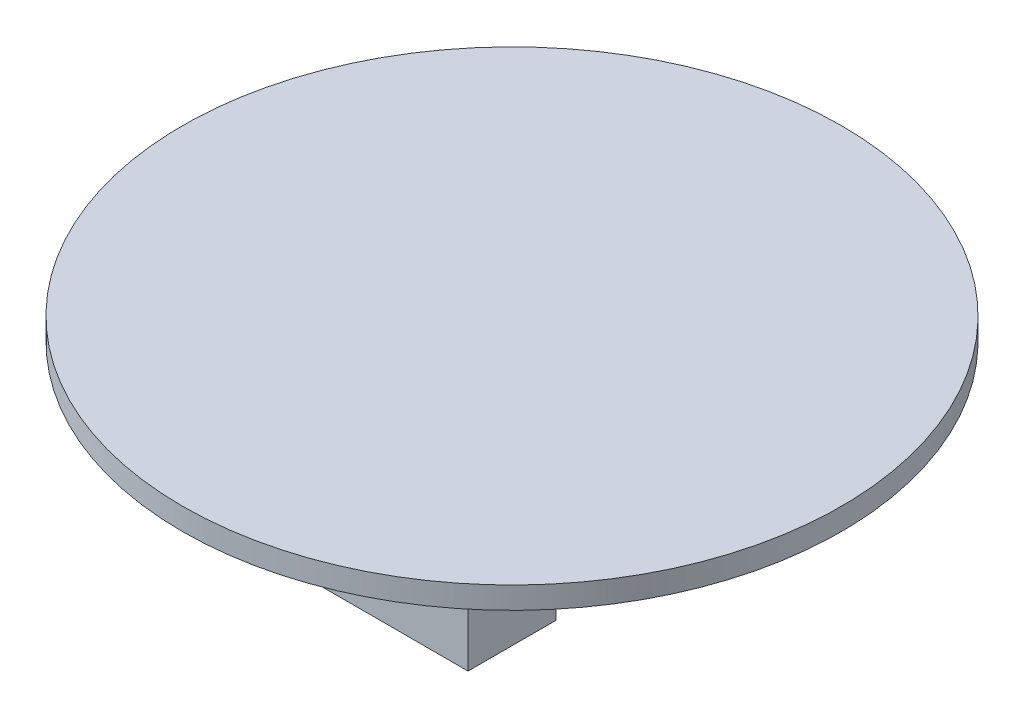
ISO-10303-21;
HEADER;
FILE_DESCRIPTION(('STEP AP214'),'2;1');
FILE_NAME('part.step','',(''),(''),'','','');
FILE_SCHEMA(('AUTOMOTIVE_DESIGN { 1 0 10303 214 1 1 1 1 }'));
ENDSEC;
DATA;
#1=APPLICATION_CONTEXT('core data for automotive mechanical design processes');
#2=APPLICATION_PROTOCOL_DEFINITION('international standard','automotive_design',2000,#1);
#3=PRODUCT_CONTEXT('',#1,'mechanical');
#4=PRODUCT('Part','Part','',(#3));
#5=PRODUCT_RELATED_PRODUCT_CATEGORY('part','',(#4));
#6=PRODUCT_DEFINITION_FORMATION('','',#4);
#7=PRODUCT_DEFINITION_CONTEXT('part definition',#1,'design');
#8=PRODUCT_DEFINITION('design','',#6,#7);
#9=PRODUCT_DEFINITION_SHAPE('','',#8);
#10=(LENGTH_UNIT() NAMED_UNIT(*) SI_UNIT(.MILLI.,.METRE.));
#11=(NAMED_UNIT(*) PLANE_ANGLE_UNIT() SI_UNIT($,.RADIAN.));
#12=(NAMED_UNIT(*) SI_UNIT($,.STERADIAN.) SOLID_ANGLE_UNIT());
#13=UNCERTAINTY_MEASURE_WITH_UNIT(LENGTH_MEASURE(1.E-05),#10,'distance_accuracy_value','');
#14=(GEOMETRIC_REPRESENTATION_CONTEXT(3) GLOBAL_UNCERTAINTY_ASSIGNED_CONTEXT((#13)) GLOBAL_UNIT_ASSIGNED_CONTEXT((#10,
#11,#12)) REPRESENTATION_CONTEXT('',''));
#15=CARTESIAN_POINT('',(0.,0.,0.));
#16=DIRECTION('',(0.,0.,1.));
#17=DIRECTION('',(1.,0.,0.));
#18=AXIS2_PLACEMENT_3D('',#15,#16,#17);
#19=CARTESIAN_POINT('',(0.,-20.,0.));
#20=DIRECTION('',(0.,-1.,0.));
#21=DIRECTION('',(0.,0.,-1.));
#22=AXIS2_PLACEMENT_3D('',#19,#20,#21);
#23=PLANE('',#22);
#24=DIRECTION('',(1.,0.,0.));
#25=VECTOR('',#24,1.);
#26=CARTESIAN_POINT('',(-75.001,-20.,36.25));
#27=LINE('',#26,#25);
#28=CARTESIAN_POINT('',(-9.99999999999999,-20.,36.25));
#29=VERTEX_POINT('',#28);
#30=CARTESIAN_POINT('',(-7.5,-20.,36.25));
#31=VERTEX_POINT('',#30);
#32=EDGE_CURVE('E183',#29,#31,#27,.T.);
#33=ORIENTED_EDGE('',*,*,#32,.F.);
#34=DIRECTION('',(0.,0.,-1.));
#35=VECTOR('',#34,1.);
#36=CARTESIAN_POINT('',(-10.,-20.,50.));
#37=LINE('',#36,#35);
#38=CARTESIAN_POINT('',(-10.,-20.,30.));
#39=VERTEX_POINT('',#38);
#40=EDGE_CURVE('E251',#29,#39,#37,.T.);
#41=ORIENTED_EDGE('',*,*,#40,.T.);
#42=DIRECTION('',(1.,0.,0.));
#43=VECTOR('',#42,1.);
#44=CARTESIAN_POINT('',(-10.,-20.,30.));
#45=LINE('',#44,#43);
#46=CARTESIAN_POINT('',(40.,-20.,30.));
#47=VERTEX_POINT('',#46);
#48=EDGE_CURVE('E250',#39,#47,#45,.T.);
#49=ORIENTED_EDGE('',*,*,#48,.T.);
#50=DIRECTION('',(0.,0.,1.));
#51=VECTOR('',#50,1.);
#52=CARTESIAN_POINT('',(40.,-20.,50.));
#53=LINE('',#52,#51);
#54=CARTESIAN_POINT('',(40.,-20.,50.));
#55=VERTEX_POINT('',#54);
#56=EDGE_CURVE('E253',#47,#55,#53,.T.);
#57=ORIENTED_EDGE('',*,*,#56,.T.);
#58=DIRECTION('',(-1.,0.,0.));
#59=VECTOR('',#58,1.);
#60=CARTESIAN_POINT('',(-10.,-20.,50.));
#61=LINE('',#60,#59);
#62=CARTESIAN_POINT('',(-10.,-20.,50.));
#63=VERTEX_POINT('',#62);
#64=EDGE_CURVE('E255',#55,#63,#61,.T.);
#65=ORIENTED_EDGE('',*,*,#64,.T.);
#66=CARTESIAN_POINT('',(-9.99999999999999,-20.,43.75));
#67=VERTEX_POINT('',#66);
#68=EDGE_CURVE('E248',#63,#67,#37,.T.);
#69=ORIENTED_EDGE('',*,*,#68,.T.);
#70=DIRECTION('',(1.,0.,0.));
#71=VECTOR('',#70,1.);
#72=CARTESIAN_POINT('',(-75.001,-20.,43.75));
#73=LINE('',#72,#71);
#74=CARTESIAN_POINT('',(-7.5,-20.,43.75));
#75=VERTEX_POINT('',#74);
#76=EDGE_CURVE('E154',#67,#75,#73,.T.);
#77=ORIENTED_EDGE('',*,*,#76,.T.);
#78=DIRECTION('',(0.,0.,1.));
#79=VECTOR('',#78,1.);
#80=CARTESIAN_POINT('',(-7.5,-20.,32.));
#81=LINE('',#80,#79);
#82=CARTESIAN_POINT('',(-7.5,-20.,48.));
#83=VERTEX_POINT('',#82);
#84=EDGE_CURVE('E56',#75,#83,#81,.T.);
#85=ORIENTED_EDGE('',*,*,#84,.T.);
#86=DIRECTION('',(-1.,0.,0.));
#87=VECTOR('',#86,1.);
#88=CARTESIAN_POINT('',(10.5,-20.,48.));
#89=LINE('',#88,#87);
#90=CARTESIAN_POINT('',(10.5,-20.,48.));
#91=VERTEX_POINT('',#90);
#92=EDGE_CURVE('E226',#91,#83,#89,.T.);
#93=ORIENTED_EDGE('',*,*,#92,.F.);
#94=DIRECTION('',(0.,0.,1.));
#95=VECTOR('',#94,1.);
#96=CARTESIAN_POINT('',(10.5,-20.,31.));
#97=LINE('',#96,#95);
#98=CARTESIAN_POINT('',(10.5,-20.,49.));
#99=VERTEX_POINT('',#98);
#100=EDGE_CURVE('E163',#91,#99,#97,.T.);
#101=ORIENTED_EDGE('',*,*,#100,.T.);
#102=DIRECTION('',(-1.,0.,0.));
#103=VECTOR('',#102,1.);
#104=CARTESIAN_POINT('',(37.5,-20.,49.));
#105=LINE('',#104,#103);
#106=CARTESIAN_POINT('',(37.5,-20.,49.));
#107=VERTEX_POINT('',#106);
#108=EDGE_CURVE('E199',#107,#99,#105,.T.);
#109=ORIENTED_EDGE('',*,*,#108,.F.);
#110=DIRECTION('',(0.,0.,1.));
#111=VECTOR('',#110,1.);
#112=CARTESIAN_POINT('',(37.5,-20.,31.));
#113=LINE('',#112,#111);
#114=CARTESIAN_POINT('',(37.5,-20.,31.));
#115=VERTEX_POINT('',#114);
#116=EDGE_CURVE('E186',#115,#107,#113,.T.);
#117=ORIENTED_EDGE('',*,*,#116,.F.);
#118=DIRECTION('',(-1.,0.,0.));
#119=VECTOR('',#118,1.);
#120=CARTESIAN_POINT('',(37.5,-20.,31.));
#121=LINE('',#120,#119);
#122=CARTESIAN_POINT('',(10.5,-20.,31.));
#123=VERTEX_POINT('',#122);
#124=EDGE_CURVE('E211',#115,#123,#121,.T.);
#125=ORIENTED_EDGE('',*,*,#124,.T.);
#126=CARTESIAN_POINT('',(10.5,-20.,32.));
#127=VERTEX_POINT('',#126);
#128=EDGE_CURVE('E200',#123,#127,#97,.T.);
#129=ORIENTED_EDGE('',*,*,#128,.T.);
#130=DIRECTION('',(-1.,0.,0.));
#131=VECTOR('',#130,1.);
#132=CARTESIAN_POINT('',(10.5,-20.,32.));
#133=LINE('',#132,#131);
#134=CARTESIAN_POINT('',(-7.5,-20.,32.));
#135=VERTEX_POINT('',#134);
#136=EDGE_CURVE('E238',#127,#135,#133,.T.);
#137=ORIENTED_EDGE('',*,*,#136,.T.);
#138=EDGE_CURVE('E227',#135,#31,#81,.T.);
#139=ORIENTED_EDGE('',*,*,#138,.T.);
#140=EDGE_LOOP('',(#33,#41,#49,#57,#65,#69,#77,#85,#93,#101,#109,#117,#125,#129,#137,#139));
#141=FACE_BOUND('',#140,.T.);
#142=ADVANCED_FACE('F33',(#141),#23,.T.);
#143=CARTESIAN_POINT('',(0.,0.,0.));
#144=DIRECTION('',(0.,1.,0.));
#145=DIRECTION('',(0.,0.,1.));
#146=AXIS2_PLACEMENT_3D('',#143,#144,#145);
#147=PLANE('',#146);
#148=CARTESIAN_POINT('',(0.,0.,0.));
#149=DIRECTION('',(0.,1.,0.));
#150=DIRECTION('',(0.,0.,1.));
#151=AXIS2_PLACEMENT_3D('',#148,#149,#150);
#152=CIRCLE('',#151,75.);
#153=CARTESIAN_POINT('',(0.,0.,75.));
#154=VERTEX_POINT('',#153);
#155=EDGE_CURVE('E37',#154,#154,#152,.T.);
#156=ORIENTED_EDGE('',*,*,#155,.F.);
#157=EDGE_LOOP('',(#156));
#158=FACE_BOUND('',#157,.T.);
#159=DIRECTION('',(0.,0.,-1.));
#160=VECTOR('',#159,1.);
#161=CARTESIAN_POINT('',(-10.,0.,50.));
#162=LINE('',#161,#160);
#163=CARTESIAN_POINT('',(-10.,0.,50.));
#164=VERTEX_POINT('',#163);
#165=CARTESIAN_POINT('',(-10.,0.,30.));
#166=VERTEX_POINT('',#165);
#167=EDGE_CURVE('E241',#164,#166,#162,.T.);
#168=ORIENTED_EDGE('',*,*,#167,.F.);
#169=DIRECTION('',(-1.,0.,0.));
#170=VECTOR('',#169,1.);
#171=CARTESIAN_POINT('',(-10.,0.,50.));
#172=LINE('',#171,#170);
#173=CARTESIAN_POINT('',(40.,0.,50.));
#174=VERTEX_POINT('',#173);
#175=EDGE_CURVE('E266',#174,#164,#172,.T.);
#176=ORIENTED_EDGE('',*,*,#175,.F.);
#177=DIRECTION('',(0.,0.,1.));
#178=VECTOR('',#177,1.);
#179=CARTESIAN_POINT('',(40.,0.,50.));
#180=LINE('',#179,#178);
#181=CARTESIAN_POINT('',(40.,0.,30.));
#182=VERTEX_POINT('',#181);
#183=EDGE_CURVE('E263',#182,#174,#180,.T.);
#184=ORIENTED_EDGE('',*,*,#183,.F.);
#185=DIRECTION('',(1.,0.,0.));
#186=VECTOR('',#185,1.);
#187=CARTESIAN_POINT('',(-10.,0.,30.));
#188=LINE('',#187,#186);
#189=EDGE_CURVE('E260',#166,#182,#188,.T.);
#190=ORIENTED_EDGE('',*,*,#189,.F.);
#191=EDGE_LOOP('',(#168,#176,#184,#190));
#192=FACE_BOUND('',#191,.T.);
#193=ADVANCED_FACE('F286',(#158,#192),#147,.F.);
#194=CARTESIAN_POINT('',(0.,5.,0.));
#195=DIRECTION('',(0.,-1.,0.));
#196=DIRECTION('',(0.,0.,-1.));
#197=AXIS2_PLACEMENT_3D('',#194,#195,#196);
#198=CYLINDRICAL_SURFACE('',#197,75.);
#199=CARTESIAN_POINT('',(0.,5.,0.));
#200=DIRECTION('',(0.,1.,0.));
#201=DIRECTION('',(0.,0.,1.));
#202=AXIS2_PLACEMENT_3D('',#199,#200,#201);
#203=CIRCLE('',#202,75.);
#204=CARTESIAN_POINT('',(0.,5.,75.));
#205=VERTEX_POINT('',#204);
#206=EDGE_CURVE('E11',#205,#205,#203,.T.);
#207=ORIENTED_EDGE('',*,*,#206,.F.);
#208=EDGE_LOOP('',(#207));
#209=FACE_BOUND('',#208,.T.);
#210=ORIENTED_EDGE('',*,*,#155,.T.);
#211=EDGE_LOOP('',(#210));
#212=FACE_BOUND('',#211,.T.);
#213=ADVANCED_FACE('F35',(#209,#212),#198,.T.);
#214=CARTESIAN_POINT('',(0.,5.,0.));
#215=DIRECTION('',(0.,1.,0.));
#216=DIRECTION('',(0.,0.,1.));
#217=AXIS2_PLACEMENT_3D('',#214,#215,#216);
#218=PLANE('',#217);
#219=ORIENTED_EDGE('',*,*,#206,.T.);
#220=EDGE_LOOP('',(#219));
#221=FACE_BOUND('',#220,.T.);
#222=ADVANCED_FACE('F356',(#221),#218,.T.);
#223=CARTESIAN_POINT('',(-10.,-20.,50.));
#224=DIRECTION('',(1.,0.,0.));
#225=DIRECTION('',(0.,0.,-1.));
#226=AXIS2_PLACEMENT_3D('',#223,#224,#225);
#227=PLANE('',#226);
#228=CARTESIAN_POINT('',(-10.,-15.,34.5));
#229=DIRECTION('',(-1.,0.,0.));
#230=DIRECTION('',(0.,0.,-1.));
#231=AXIS2_PLACEMENT_3D('',#228,#229,#230);
#232=CIRCLE('',#231,0.999999999999998);
#233=CARTESIAN_POINT('',(-10.,-15.,33.5));
#234=VERTEX_POINT('',#233);
#235=EDGE_CURVE('E519',#234,#234,#232,.T.);
#236=ORIENTED_EDGE('',*,*,#235,.F.);
#237=EDGE_LOOP('',(#236));
#238=FACE_BOUND('',#237,.T.);
#239=CARTESIAN_POINT('',(-10.,-15.,45.5));
#240=DIRECTION('',(-1.,0.,0.));
#241=DIRECTION('',(0.,0.,1.));
#242=AXIS2_PLACEMENT_3D('',#239,#240,#241);
#243=CIRCLE('',#242,0.999999999999998);
#244=CARTESIAN_POINT('',(-10.,-15.,46.5));
#245=VERTEX_POINT('',#244);
#246=EDGE_CURVE('E173',#245,#245,#243,.T.);
#247=ORIENTED_EDGE('',*,*,#246,.F.);
#248=EDGE_LOOP('',(#247));
#249=FACE_BOUND('',#248,.T.);
#250=ORIENTED_EDGE('',*,*,#40,.F.);
#251=DIRECTION('',(0.,-1.,0.));
#252=VECTOR('',#251,1.);
#253=CARTESIAN_POINT('',(-9.99999999999999,-15.,36.25));
#254=LINE('',#253,#252);
#255=CARTESIAN_POINT('',(-9.99999999999999,-15.,36.25));
#256=VERTEX_POINT('',#255);
#257=EDGE_CURVE('E168',#256,#29,#254,.T.);
#258=ORIENTED_EDGE('',*,*,#257,.F.);
#259=CARTESIAN_POINT('',(-9.99999999999999,-15.,40.));
#260=DIRECTION('',(1.,0.,0.));
#261=DIRECTION('',(0.,0.,-1.));
#262=AXIS2_PLACEMENT_3D('',#259,#260,#261);
#263=CIRCLE('',#262,3.75);
#264=CARTESIAN_POINT('',(-9.99999999999999,-15.,43.75));
#265=VERTEX_POINT('',#264);
#266=EDGE_CURVE('E150',#265,#256,#263,.F.);
#267=ORIENTED_EDGE('',*,*,#266,.F.);
#268=DIRECTION('',(0.,1.,0.));
#269=VECTOR('',#268,1.);
#270=CARTESIAN_POINT('',(-9.99999999999999,-15.,43.75));
#271=LINE('',#270,#269);
#272=EDGE_CURVE('E158',#67,#265,#271,.T.);
#273=ORIENTED_EDGE('',*,*,#272,.F.);
#274=ORIENTED_EDGE('',*,*,#68,.F.);
#275=DIRECTION('',(0.,1.,0.));
#276=VECTOR('',#275,1.);
#277=CARTESIAN_POINT('',(-10.,-20.,50.));
#278=LINE('',#277,#276);
#279=EDGE_CURVE('E257',#63,#164,#278,.T.);
#280=ORIENTED_EDGE('',*,*,#279,.T.);
#281=ORIENTED_EDGE('',*,*,#167,.T.);
#282=DIRECTION('',(0.,1.,0.));
#283=VECTOR('',#282,1.);
#284=CARTESIAN_POINT('',(-10.,-20.,30.));
#285=LINE('',#284,#283);
#286=EDGE_CURVE('E277',#39,#166,#285,.T.);
#287=ORIENTED_EDGE('',*,*,#286,.F.);
#288=EDGE_LOOP('',(#250,#258,#267,#273,#274,#280,#281,#287));
#289=FACE_BOUND('',#288,.T.);
#290=ADVANCED_FACE('F167',(#238,#249,#289),#227,.F.);
#291=CARTESIAN_POINT('',(-10.,-20.,30.));
#292=DIRECTION('',(0.,0.,1.));
#293=DIRECTION('',(1.,0.,0.));
#294=AXIS2_PLACEMENT_3D('',#291,#292,#293);
#295=PLANE('',#294);
#296=ORIENTED_EDGE('',*,*,#189,.T.);
#297=DIRECTION('',(0.,1.,0.));
#298=VECTOR('',#297,1.);
#299=CARTESIAN_POINT('',(40.,-20.,30.));
#300=LINE('',#299,#298);
#301=EDGE_CURVE('E274',#47,#182,#300,.T.);
#302=ORIENTED_EDGE('',*,*,#301,.F.);
#303=ORIENTED_EDGE('',*,*,#48,.F.);
#304=ORIENTED_EDGE('',*,*,#286,.T.);
#305=EDGE_LOOP('',(#296,#302,#303,#304));
#306=FACE_BOUND('',#305,.T.);
#307=ADVANCED_FACE('F299',(#306),#295,.F.);
#308=CARTESIAN_POINT('',(40.,-20.,50.));
#309=DIRECTION('',(-1.,0.,0.));
#310=DIRECTION('',(0.,0.,1.));
#311=AXIS2_PLACEMENT_3D('',#308,#309,#310);
#312=PLANE('',#311);
#313=ORIENTED_EDGE('',*,*,#183,.T.);
#314=DIRECTION('',(0.,1.,0.));
#315=VECTOR('',#314,1.);
#316=CARTESIAN_POINT('',(40.,-20.,50.));
#317=LINE('',#316,#315);
#318=EDGE_CURVE('E271',#55,#174,#317,.T.);
#319=ORIENTED_EDGE('',*,*,#318,.F.);
#320=ORIENTED_EDGE('',*,*,#56,.F.);
#321=ORIENTED_EDGE('',*,*,#301,.T.);
#322=EDGE_LOOP('',(#313,#319,#320,#321));
#323=FACE_BOUND('',#322,.T.);
#324=ADVANCED_FACE('F298',(#323),#312,.F.);
#325=CARTESIAN_POINT('',(-10.,-20.,50.));
#326=DIRECTION('',(0.,0.,-1.));
#327=DIRECTION('',(-1.,0.,0.));
#328=AXIS2_PLACEMENT_3D('',#325,#326,#327);
#329=PLANE('',#328);
#330=ORIENTED_EDGE('',*,*,#175,.T.);
#331=ORIENTED_EDGE('',*,*,#279,.F.);
#332=ORIENTED_EDGE('',*,*,#64,.F.);
#333=ORIENTED_EDGE('',*,*,#318,.T.);
#334=EDGE_LOOP('',(#330,#331,#332,#333));
#335=FACE_BOUND('',#334,.T.);
#336=ADVANCED_FACE('F291',(#335),#329,.F.);
#337=CARTESIAN_POINT('',(10.5,-15.,32.));
#338=DIRECTION('',(0.,0.,-1.));
#339=DIRECTION('',(-1.,0.,0.));
#340=AXIS2_PLACEMENT_3D('',#337,#338,#339);
#341=PLANE('',#340);
#342=DIRECTION('',(0.,-1.,0.));
#343=VECTOR('',#342,1.);
#344=CARTESIAN_POINT('',(-7.5,-15.,32.));
#345=LINE('',#344,#343);
#346=CARTESIAN_POINT('',(-7.5,-15.,32.));
#347=VERTEX_POINT('',#346);
#348=EDGE_CURVE('E222',#347,#135,#345,.T.);
#349=ORIENTED_EDGE('',*,*,#348,.T.);
#350=ORIENTED_EDGE('',*,*,#136,.F.);
#351=DIRECTION('',(0.,-1.,0.));
#352=VECTOR('',#351,1.);
#353=CARTESIAN_POINT('',(10.5,-15.,32.));
#354=LINE('',#353,#352);
#355=CARTESIAN_POINT('',(10.5,-15.,32.));
#356=VERTEX_POINT('',#355);
#357=EDGE_CURVE('E224',#356,#127,#354,.T.);
#358=ORIENTED_EDGE('',*,*,#357,.F.);
#359=DIRECTION('',(-1.,0.,0.));
#360=VECTOR('',#359,1.);
#361=CARTESIAN_POINT('',(10.5,-15.,32.));
#362=LINE('',#361,#360);
#363=EDGE_CURVE('E242',#356,#347,#362,.T.);
#364=ORIENTED_EDGE('',*,*,#363,.T.);
#365=EDGE_LOOP('',(#349,#350,#358,#364));
#366=FACE_BOUND('',#365,.T.);
#367=ADVANCED_FACE('F332',(#366),#341,.F.);
#368=CARTESIAN_POINT('',(10.5,-15.,40.));
#369=DIRECTION('',(-1.,0.,0.));
#370=DIRECTION('',(0.,0.,1.));
#371=AXIS2_PLACEMENT_3D('',#368,#369,#370);
#372=CYLINDRICAL_SURFACE('',#371,8.);
#373=CARTESIAN_POINT('',(-7.5,-15.,40.));
#374=DIRECTION('',(-1.,0.,0.));
#375=DIRECTION('',(0.,0.,1.));
#376=AXIS2_PLACEMENT_3D('',#373,#374,#375);
#377=CIRCLE('',#376,8.);
#378=CARTESIAN_POINT('',(-7.5,-15.,48.));
#379=VERTEX_POINT('',#378);
#380=EDGE_CURVE('E233',#379,#347,#377,.T.);
#381=ORIENTED_EDGE('',*,*,#380,.T.);
#382=ORIENTED_EDGE('',*,*,#363,.F.);
#383=CARTESIAN_POINT('',(10.5,-15.,40.));
#384=DIRECTION('',(-1.,0.,0.));
#385=DIRECTION('',(0.,0.,1.));
#386=AXIS2_PLACEMENT_3D('',#383,#384,#385);
#387=CIRCLE('',#386,8.);
#388=CARTESIAN_POINT('',(10.5,-15.,48.));
#389=VERTEX_POINT('',#388);
#390=EDGE_CURVE('E221',#389,#356,#387,.T.);
#391=ORIENTED_EDGE('',*,*,#390,.F.);
#392=DIRECTION('',(-1.,0.,0.));
#393=VECTOR('',#392,1.);
#394=CARTESIAN_POINT('',(10.5,-15.,48.));
#395=LINE('',#394,#393);
#396=EDGE_CURVE('E244',#389,#379,#395,.T.);
#397=ORIENTED_EDGE('',*,*,#396,.T.);
#398=EDGE_LOOP('',(#381,#382,#391,#397));
#399=FACE_BOUND('',#398,.T.);
#400=ADVANCED_FACE('F334',(#399),#372,.F.);
#401=CARTESIAN_POINT('',(10.5,-15.,48.));
#402=DIRECTION('',(0.,0.,1.));
#403=DIRECTION('',(1.,0.,0.));
#404=AXIS2_PLACEMENT_3D('',#401,#402,#403);
#405=PLANE('',#404);
#406=DIRECTION('',(0.,1.,0.));
#407=VECTOR('',#406,1.);
#408=CARTESIAN_POINT('',(-7.5,-15.,48.));
#409=LINE('',#408,#407);
#410=EDGE_CURVE('E230',#83,#379,#409,.T.);
#411=ORIENTED_EDGE('',*,*,#410,.T.);
#412=ORIENTED_EDGE('',*,*,#396,.F.);
#413=DIRECTION('',(0.,1.,0.));
#414=VECTOR('',#413,1.);
#415=CARTESIAN_POINT('',(10.5,-15.,48.));
#416=LINE('',#415,#414);
#417=EDGE_CURVE('E219',#91,#389,#416,.T.);
#418=ORIENTED_EDGE('',*,*,#417,.F.);
#419=ORIENTED_EDGE('',*,*,#92,.T.);
#420=EDGE_LOOP('',(#411,#412,#418,#419));
#421=FACE_BOUND('',#420,.T.);
#422=ADVANCED_FACE('F310',(#421),#405,.F.);
#423=CARTESIAN_POINT('',(-7.5,-15.,40.));
#424=DIRECTION('',(-1.,0.,0.));
#425=DIRECTION('',(0.,0.,1.));
#426=AXIS2_PLACEMENT_3D('',#423,#424,#425);
#427=PLANE('',#426);
#428=CARTESIAN_POINT('',(-7.50000000000001,-15.,34.5));
#429=DIRECTION('',(-1.,0.,0.));
#430=DIRECTION('',(0.,0.,1.));
#431=AXIS2_PLACEMENT_3D('',#428,#429,#430);
#432=CIRCLE('',#431,0.999999999999998);
#433=CARTESIAN_POINT('',(-7.50000000000001,-15.,35.5));
#434=VERTEX_POINT('',#433);
#435=EDGE_CURVE('E522',#434,#434,#432,.F.);
#436=ORIENTED_EDGE('',*,*,#435,.F.);
#437=EDGE_LOOP('',(#436));
#438=FACE_BOUND('',#437,.T.);
#439=CARTESIAN_POINT('',(-7.50000000000001,-15.,45.5));
#440=DIRECTION('',(-1.,0.,0.));
#441=DIRECTION('',(0.,0.,1.));
#442=AXIS2_PLACEMENT_3D('',#439,#440,#441);
#443=CIRCLE('',#442,0.999999999999998);
#444=CARTESIAN_POINT('',(-7.50000000000001,-15.,46.5));
#445=VERTEX_POINT('',#444);
#446=EDGE_CURVE('E169',#445,#445,#443,.F.);
#447=ORIENTED_EDGE('',*,*,#446,.F.);
#448=EDGE_LOOP('',(#447));
#449=FACE_BOUND('',#448,.T.);
#450=CARTESIAN_POINT('',(-7.5,-15.,40.));
#451=DIRECTION('',(1.,0.,0.));
#452=DIRECTION('',(0.,0.,-1.));
#453=AXIS2_PLACEMENT_3D('',#450,#451,#452);
#454=CIRCLE('',#453,3.75);
#455=CARTESIAN_POINT('',(-7.5,-15.,36.25));
#456=VERTEX_POINT('',#455);
#457=CARTESIAN_POINT('',(-7.5,-15.,43.75));
#458=VERTEX_POINT('',#457);
#459=EDGE_CURVE('E48',#456,#458,#454,.T.);
#460=ORIENTED_EDGE('',*,*,#459,.F.);
#461=DIRECTION('',(0.,1.,0.));
#462=VECTOR('',#461,1.);
#463=CARTESIAN_POINT('',(-7.5,-15.,36.25));
#464=LINE('',#463,#462);
#465=EDGE_CURVE('E155',#31,#456,#464,.T.);
#466=ORIENTED_EDGE('',*,*,#465,.F.);
#467=ORIENTED_EDGE('',*,*,#138,.F.);
#468=ORIENTED_EDGE('',*,*,#348,.F.);
#469=ORIENTED_EDGE('',*,*,#380,.F.);
#470=ORIENTED_EDGE('',*,*,#410,.F.);
#471=ORIENTED_EDGE('',*,*,#84,.F.);
#472=DIRECTION('',(0.,-1.,0.));
#473=VECTOR('',#472,1.);
#474=CARTESIAN_POINT('',(-7.5,-15.,43.75));
#475=LINE('',#474,#473);
#476=EDGE_CURVE('E178',#458,#75,#475,.T.);
#477=ORIENTED_EDGE('',*,*,#476,.F.);
#478=EDGE_LOOP('',(#460,#466,#467,#468,#469,#470,#471,#477));
#479=FACE_BOUND('',#478,.T.);
#480=ADVANCED_FACE('F304',(#438,#449,#479),#427,.F.);
#481=CARTESIAN_POINT('',(10.5,-15.,40.));
#482=DIRECTION('',(-1.,0.,0.));
#483=DIRECTION('',(0.,0.,1.));
#484=AXIS2_PLACEMENT_3D('',#481,#482,#483);
#485=PLANE('',#484);
#486=ORIENTED_EDGE('',*,*,#128,.F.);
#487=DIRECTION('',(0.,-1.,0.));
#488=VECTOR('',#487,1.);
#489=CARTESIAN_POINT('',(10.5,-15.,31.));
#490=LINE('',#489,#488);
#491=CARTESIAN_POINT('',(10.5,-15.,31.));
#492=VERTEX_POINT('',#491);
#493=EDGE_CURVE('E190',#492,#123,#490,.T.);
#494=ORIENTED_EDGE('',*,*,#493,.F.);
#495=CARTESIAN_POINT('',(10.5,-15.,40.));
#496=DIRECTION('',(-1.,0.,0.));
#497=DIRECTION('',(0.,0.,1.));
#498=AXIS2_PLACEMENT_3D('',#495,#496,#497);
#499=CIRCLE('',#498,9.00000000000001);
#500=CARTESIAN_POINT('',(10.5,-15.,49.));
#501=VERTEX_POINT('',#500);
#502=EDGE_CURVE('E206',#501,#492,#499,.T.);
#503=ORIENTED_EDGE('',*,*,#502,.F.);
#504=DIRECTION('',(0.,1.,0.));
#505=VECTOR('',#504,1.);
#506=CARTESIAN_POINT('',(10.5,-15.,49.));
#507=LINE('',#506,#505);
#508=EDGE_CURVE('E203',#99,#501,#507,.T.);
#509=ORIENTED_EDGE('',*,*,#508,.F.);
#510=ORIENTED_EDGE('',*,*,#100,.F.);
#511=ORIENTED_EDGE('',*,*,#417,.T.);
#512=ORIENTED_EDGE('',*,*,#390,.T.);
#513=ORIENTED_EDGE('',*,*,#357,.T.);
#514=EDGE_LOOP('',(#486,#494,#503,#509,#510,#511,#512,#513));
#515=FACE_BOUND('',#514,.T.);
#516=ADVANCED_FACE('F316',(#515),#485,.F.);
#517=CARTESIAN_POINT('',(37.5,-15.,31.));
#518=DIRECTION('',(0.,0.,-1.));
#519=DIRECTION('',(0.,1.,0.));
#520=AXIS2_PLACEMENT_3D('',#517,#518,#519);
#521=PLANE('',#520);
#522=ORIENTED_EDGE('',*,*,#493,.T.);
#523=ORIENTED_EDGE('',*,*,#124,.F.);
#524=DIRECTION('',(0.,-1.,0.));
#525=VECTOR('',#524,1.);
#526=CARTESIAN_POINT('',(37.5,-15.,31.));
#527=LINE('',#526,#525);
#528=CARTESIAN_POINT('',(37.5,-15.,31.));
#529=VERTEX_POINT('',#528);
#530=EDGE_CURVE('E196',#529,#115,#527,.T.);
#531=ORIENTED_EDGE('',*,*,#530,.F.);
#532=DIRECTION('',(-1.,0.,0.));
#533=VECTOR('',#532,1.);
#534=CARTESIAN_POINT('',(37.5,-15.,31.));
#535=LINE('',#534,#533);
#536=EDGE_CURVE('E214',#529,#492,#535,.T.);
#537=ORIENTED_EDGE('',*,*,#536,.T.);
#538=EDGE_LOOP('',(#522,#523,#531,#537));
#539=FACE_BOUND('',#538,.T.);
#540=ADVANCED_FACE('F327',(#539),#521,.F.);
#541=CARTESIAN_POINT('',(37.5,-15.,40.));
#542=DIRECTION('',(-1.,0.,0.));
#543=DIRECTION('',(0.,0.,1.));
#544=AXIS2_PLACEMENT_3D('',#541,#542,#543);
#545=CYLINDRICAL_SURFACE('',#544,9.00000000000001);
#546=ORIENTED_EDGE('',*,*,#502,.T.);
#547=ORIENTED_EDGE('',*,*,#536,.F.);
#548=CARTESIAN_POINT('',(37.5,-15.,40.));
#549=DIRECTION('',(-1.,0.,0.));
#550=DIRECTION('',(0.,0.,1.));
#551=AXIS2_PLACEMENT_3D('',#548,#549,#550);
#552=CIRCLE('',#551,9.00000000000001);
#553=CARTESIAN_POINT('',(37.5,-15.,49.));
#554=VERTEX_POINT('',#553);
#555=EDGE_CURVE('E193',#554,#529,#552,.T.);
#556=ORIENTED_EDGE('',*,*,#555,.F.);
#557=DIRECTION('',(-1.,0.,0.));
#558=VECTOR('',#557,1.);
#559=CARTESIAN_POINT('',(37.5,-15.,49.));
#560=LINE('',#559,#558);
#561=EDGE_CURVE('E216',#554,#501,#560,.T.);
#562=ORIENTED_EDGE('',*,*,#561,.T.);
#563=EDGE_LOOP('',(#546,#547,#556,#562));
#564=FACE_BOUND('',#563,.T.);
#565=ADVANCED_FACE('F428',(#564),#545,.F.);
#566=CARTESIAN_POINT('',(37.5,-15.,49.));
#567=DIRECTION('',(0.,0.,1.));
#568=DIRECTION('',(0.,-1.,0.));
#569=AXIS2_PLACEMENT_3D('',#566,#567,#568);
#570=PLANE('',#569);
#571=ORIENTED_EDGE('',*,*,#508,.T.);
#572=ORIENTED_EDGE('',*,*,#561,.F.);
#573=DIRECTION('',(0.,1.,0.));
#574=VECTOR('',#573,1.);
#575=CARTESIAN_POINT('',(37.5,-15.,49.));
#576=LINE('',#575,#574);
#577=EDGE_CURVE('E189',#107,#554,#576,.T.);
#578=ORIENTED_EDGE('',*,*,#577,.F.);
#579=ORIENTED_EDGE('',*,*,#108,.T.);
#580=EDGE_LOOP('',(#571,#572,#578,#579));
#581=FACE_BOUND('',#580,.T.);
#582=ADVANCED_FACE('F320',(#581),#570,.F.);
#583=CARTESIAN_POINT('',(37.5,-15.,40.));
#584=DIRECTION('',(-1.,0.,0.));
#585=DIRECTION('',(0.,0.,1.));
#586=AXIS2_PLACEMENT_3D('',#583,#584,#585);
#587=PLANE('',#586);
#588=ORIENTED_EDGE('',*,*,#116,.T.);
#589=ORIENTED_EDGE('',*,*,#577,.T.);
#590=ORIENTED_EDGE('',*,*,#555,.T.);
#591=ORIENTED_EDGE('',*,*,#530,.T.);
#592=EDGE_LOOP('',(#588,#589,#590,#591));
#593=FACE_BOUND('',#592,.T.);
#594=ADVANCED_FACE('F323',(#593),#587,.T.);
#595=CARTESIAN_POINT('',(-75.001,-15.,40.));
#596=DIRECTION('',(1.,0.,0.));
#597=DIRECTION('',(0.,0.,-1.));
#598=AXIS2_PLACEMENT_3D('',#595,#596,#597);
#599=CYLINDRICAL_SURFACE('',#598,3.75);
#600=ORIENTED_EDGE('',*,*,#266,.T.);
#601=DIRECTION('',(1.,0.,0.));
#602=VECTOR('',#601,1.);
#603=CARTESIAN_POINT('',(-75.001,-15.,36.25));
#604=LINE('',#603,#602);
#605=EDGE_CURVE('E164',#256,#456,#604,.T.);
#606=ORIENTED_EDGE('',*,*,#605,.T.);
#607=ORIENTED_EDGE('',*,*,#459,.T.);
#608=DIRECTION('',(1.,0.,0.));
#609=VECTOR('',#608,1.);
#610=CARTESIAN_POINT('',(-75.001,-15.,43.75));
#611=LINE('',#610,#609);
#612=EDGE_CURVE('E146',#265,#458,#611,.T.);
#613=ORIENTED_EDGE('',*,*,#612,.F.);
#614=EDGE_LOOP('',(#600,#606,#607,#613));
#615=FACE_BOUND('',#614,.T.);
#616=ADVANCED_FACE('F148',(#615),#599,.F.);
#617=CARTESIAN_POINT('',(-75.001,-15.,36.25));
#618=DIRECTION('',(0.,0.,-1.));
#619=DIRECTION('',(-1.,0.,0.));
#620=AXIS2_PLACEMENT_3D('',#617,#618,#619);
#621=PLANE('',#620);
#622=ORIENTED_EDGE('',*,*,#257,.T.);
#623=ORIENTED_EDGE('',*,*,#32,.T.);
#624=ORIENTED_EDGE('',*,*,#465,.T.);
#625=ORIENTED_EDGE('',*,*,#605,.F.);
#626=EDGE_LOOP('',(#622,#623,#624,#625));
#627=FACE_BOUND('',#626,.T.);
#628=ADVANCED_FACE('F302',(#627),#621,.F.);
#629=CARTESIAN_POINT('',(-75.001,-15.,43.75));
#630=DIRECTION('',(0.,0.,1.));
#631=DIRECTION('',(1.,0.,0.));
#632=AXIS2_PLACEMENT_3D('',#629,#630,#631);
#633=PLANE('',#632);
#634=ORIENTED_EDGE('',*,*,#272,.T.);
#635=ORIENTED_EDGE('',*,*,#612,.T.);
#636=ORIENTED_EDGE('',*,*,#476,.T.);
#637=ORIENTED_EDGE('',*,*,#76,.F.);
#638=EDGE_LOOP('',(#634,#635,#636,#637));
#639=FACE_BOUND('',#638,.T.);
#640=ADVANCED_FACE('F159',(#639),#633,.F.);
#641=CARTESIAN_POINT('',(75.001,-15.,45.5));
#642=DIRECTION('',(-1.,0.,0.));
#643=DIRECTION('',(0.,0.,1.));
#644=AXIS2_PLACEMENT_3D('',#641,#642,#643);
#645=CYLINDRICAL_SURFACE('',#644,0.999999999999998);
#646=ORIENTED_EDGE('',*,*,#246,.T.);
#647=EDGE_LOOP('',(#646));
#648=FACE_BOUND('',#647,.T.);
#649=ORIENTED_EDGE('',*,*,#446,.T.);
#650=EDGE_LOOP('',(#649));
#651=FACE_BOUND('',#650,.T.);
#652=ADVANCED_FACE('F481',(#648,#651),#645,.F.);
#653=CARTESIAN_POINT('',(75.001,-15.,34.5));
#654=DIRECTION('',(-1.,0.,0.));
#655=DIRECTION('',(0.,0.,1.));
#656=AXIS2_PLACEMENT_3D('',#653,#654,#655);
#657=CYLINDRICAL_SURFACE('',#656,0.999999999999998);
#658=ORIENTED_EDGE('',*,*,#235,.T.);
#659=EDGE_LOOP('',(#658));
#660=FACE_BOUND('',#659,.T.);
#661=ORIENTED_EDGE('',*,*,#435,.T.);
#662=EDGE_LOOP('',(#661));
#663=FACE_BOUND('',#662,.T.);
#664=ADVANCED_FACE('F502',(#660,#663),#657,.F.);
#665=CLOSED_SHELL('',(#142,#193,#213,#222,#290,#307,#324,#336,#367,#400,#422,#480,#516,#540,
#565,#582,#594,#616,#628,#640,#652,#664));
#666=MANIFOLD_SOLID_BREP('B2',#665);
#667=ADVANCED_BREP_SHAPE_REPRESENTATION('',(#18,#666),#14);
#668=SHAPE_DEFINITION_REPRESENTATION(#9,#667);
ENDSEC;
END-ISO-10303-21;
